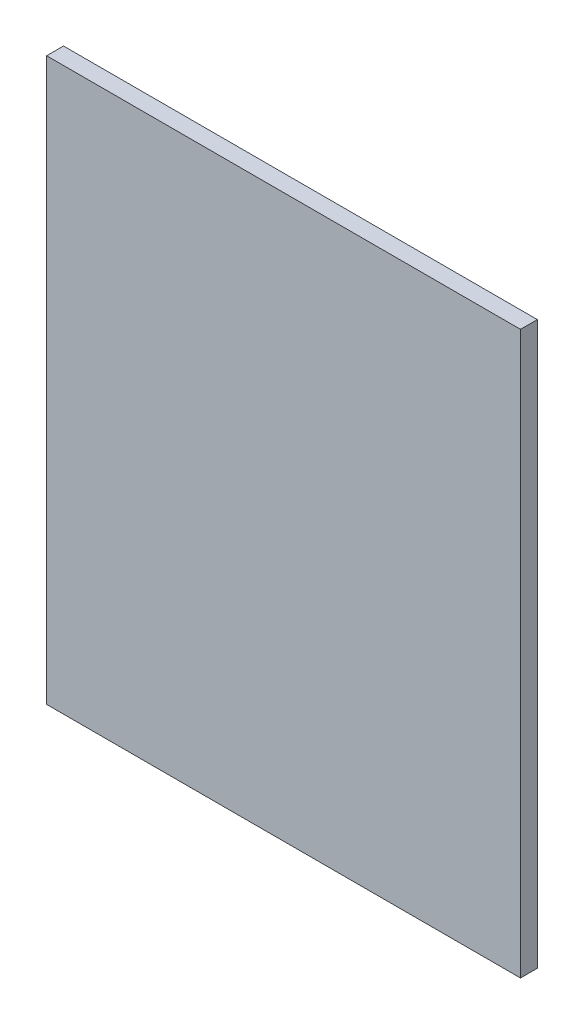
ISO-10303-21;
HEADER;
FILE_DESCRIPTION(('STEP AP214'),'2;1');
FILE_NAME('part.step','',(''),(''),'','','');
FILE_SCHEMA(('AUTOMOTIVE_DESIGN { 1 0 10303 214 1 1 1 1 }'));
ENDSEC;
DATA;
#1=APPLICATION_CONTEXT('core data for automotive mechanical design processes');
#2=APPLICATION_PROTOCOL_DEFINITION('international standard','automotive_design',2000,#1);
#3=PRODUCT_CONTEXT('',#1,'mechanical');
#4=PRODUCT('Part','Part','',(#3));
#5=PRODUCT_RELATED_PRODUCT_CATEGORY('part','',(#4));
#6=PRODUCT_DEFINITION_FORMATION('','',#4);
#7=PRODUCT_DEFINITION_CONTEXT('part definition',#1,'design');
#8=PRODUCT_DEFINITION('design','',#6,#7);
#9=PRODUCT_DEFINITION_SHAPE('','',#8);
#10=(LENGTH_UNIT() NAMED_UNIT(*) SI_UNIT(.MILLI.,.METRE.));
#11=(NAMED_UNIT(*) PLANE_ANGLE_UNIT() SI_UNIT($,.RADIAN.));
#12=(NAMED_UNIT(*) SI_UNIT($,.STERADIAN.) SOLID_ANGLE_UNIT());
#13=UNCERTAINTY_MEASURE_WITH_UNIT(LENGTH_MEASURE(1.E-05),#10,'distance_accuracy_value','');
#14=(GEOMETRIC_REPRESENTATION_CONTEXT(3) GLOBAL_UNCERTAINTY_ASSIGNED_CONTEXT((#13)) GLOBAL_UNIT_ASSIGNED_CONTEXT((#10,
#11,#12)) REPRESENTATION_CONTEXT('',''));
#15=CARTESIAN_POINT('',(0.,0.,0.));
#16=DIRECTION('',(0.,0.,1.));
#17=DIRECTION('',(1.,0.,0.));
#18=AXIS2_PLACEMENT_3D('',#15,#16,#17);
#19=CARTESIAN_POINT('',(0.,0.,2.));
#20=DIRECTION('',(1.,0.,0.));
#21=DIRECTION('',(0.,0.,-1.));
#22=AXIS2_PLACEMENT_3D('',#19,#20,#21);
#23=PLANE('',#22);
#24=DIRECTION('',(0.,-1.,0.));
#25=VECTOR('',#24,1.);
#26=CARTESIAN_POINT('',(0.,0.,0.));
#27=LINE('',#26,#25);
#28=CARTESIAN_POINT('',(0.,66.5805640276045,0.));
#29=VERTEX_POINT('',#28);
#30=CARTESIAN_POINT('',(0.,0.,0.));
#31=VERTEX_POINT('',#30);
#32=EDGE_CURVE('E96',#29,#31,#27,.T.);
#33=ORIENTED_EDGE('',*,*,#32,.T.);
#34=DIRECTION('',(0.,0.,-1.));
#35=VECTOR('',#34,1.);
#36=CARTESIAN_POINT('',(0.,0.,2.));
#37=LINE('',#36,#35);
#38=CARTESIAN_POINT('',(0.,0.,2.));
#39=VERTEX_POINT('',#38);
#40=EDGE_CURVE('E11',#39,#31,#37,.T.);
#41=ORIENTED_EDGE('',*,*,#40,.F.);
#42=DIRECTION('',(0.,-1.,0.));
#43=VECTOR('',#42,1.);
#44=CARTESIAN_POINT('',(0.,0.,2.));
#45=LINE('',#44,#43);
#46=CARTESIAN_POINT('',(0.,66.5805640276045,2.));
#47=VERTEX_POINT('',#46);
#48=EDGE_CURVE('E84',#47,#39,#45,.T.);
#49=ORIENTED_EDGE('',*,*,#48,.F.);
#50=DIRECTION('',(0.,0.,-1.));
#51=VECTOR('',#50,1.);
#52=CARTESIAN_POINT('',(0.,66.5805640276045,2.));
#53=LINE('',#52,#51);
#54=EDGE_CURVE('E92',#47,#29,#53,.T.);
#55=ORIENTED_EDGE('',*,*,#54,.T.);
#56=EDGE_LOOP('',(#33,#41,#49,#55));
#57=FACE_BOUND('',#56,.T.);
#58=ADVANCED_FACE('F33',(#57),#23,.F.);
#59=CARTESIAN_POINT('',(0.,0.,2.));
#60=DIRECTION('',(0.,1.,0.));
#61=DIRECTION('',(0.,0.,1.));
#62=AXIS2_PLACEMENT_3D('',#59,#60,#61);
#63=PLANE('',#62);
#64=DIRECTION('',(1.,0.,0.));
#65=VECTOR('',#64,1.);
#66=CARTESIAN_POINT('',(0.,0.,0.));
#67=LINE('',#66,#65);
#68=CARTESIAN_POINT('',(56.1625525865853,0.,0.));
#69=VERTEX_POINT('',#68);
#70=EDGE_CURVE('E88',#31,#69,#67,.T.);
#71=ORIENTED_EDGE('',*,*,#70,.T.);
#72=DIRECTION('',(0.,0.,-1.));
#73=VECTOR('',#72,1.);
#74=CARTESIAN_POINT('',(56.1625525865853,0.,2.));
#75=LINE('',#74,#73);
#76=CARTESIAN_POINT('',(56.1625525865853,0.,2.));
#77=VERTEX_POINT('',#76);
#78=EDGE_CURVE('E41',#77,#69,#75,.T.);
#79=ORIENTED_EDGE('',*,*,#78,.F.);
#80=DIRECTION('',(1.,0.,0.));
#81=VECTOR('',#80,1.);
#82=CARTESIAN_POINT('',(0.,0.,2.));
#83=LINE('',#82,#81);
#84=EDGE_CURVE('E79',#39,#77,#83,.T.);
#85=ORIENTED_EDGE('',*,*,#84,.F.);
#86=ORIENTED_EDGE('',*,*,#40,.T.);
#87=EDGE_LOOP('',(#71,#79,#85,#86));
#88=FACE_BOUND('',#87,.T.);
#89=ADVANCED_FACE('F87',(#88),#63,.F.);
#90=CARTESIAN_POINT('',(56.1625525865853,0.,2.));
#91=DIRECTION('',(-1.,0.,0.));
#92=DIRECTION('',(0.,0.,1.));
#93=AXIS2_PLACEMENT_3D('',#90,#91,#92);
#94=PLANE('',#93);
#95=DIRECTION('',(0.,1.,0.));
#96=VECTOR('',#95,1.);
#97=CARTESIAN_POINT('',(56.1625525865853,0.,0.));
#98=LINE('',#97,#96);
#99=CARTESIAN_POINT('',(56.1625525865853,66.5805640276045,0.));
#100=VERTEX_POINT('',#99);
#101=EDGE_CURVE('E66',#69,#100,#98,.T.);
#102=ORIENTED_EDGE('',*,*,#101,.T.);
#103=DIRECTION('',(0.,0.,-1.));
#104=VECTOR('',#103,1.);
#105=CARTESIAN_POINT('',(56.1625525865853,66.5805640276045,2.));
#106=LINE('',#105,#104);
#107=CARTESIAN_POINT('',(56.1625525865853,66.5805640276045,2.));
#108=VERTEX_POINT('',#107);
#109=EDGE_CURVE('E89',#108,#100,#106,.T.);
#110=ORIENTED_EDGE('',*,*,#109,.F.);
#111=DIRECTION('',(0.,1.,0.));
#112=VECTOR('',#111,1.);
#113=CARTESIAN_POINT('',(56.1625525865853,0.,2.));
#114=LINE('',#113,#112);
#115=EDGE_CURVE('E82',#77,#108,#114,.T.);
#116=ORIENTED_EDGE('',*,*,#115,.F.);
#117=ORIENTED_EDGE('',*,*,#78,.T.);
#118=EDGE_LOOP('',(#102,#110,#116,#117));
#119=FACE_BOUND('',#118,.T.);
#120=ADVANCED_FACE('F90',(#119),#94,.F.);
#121=CARTESIAN_POINT('',(0.,66.5805640276045,2.));
#122=DIRECTION('',(0.,-1.,0.));
#123=DIRECTION('',(0.,0.,-1.));
#124=AXIS2_PLACEMENT_3D('',#121,#122,#123);
#125=PLANE('',#124);
#126=DIRECTION('',(-1.,0.,0.));
#127=VECTOR('',#126,1.);
#128=CARTESIAN_POINT('',(0.,66.5805640276045,0.));
#129=LINE('',#128,#127);
#130=EDGE_CURVE('E72',#100,#29,#129,.T.);
#131=ORIENTED_EDGE('',*,*,#130,.T.);
#132=ORIENTED_EDGE('',*,*,#54,.F.);
#133=DIRECTION('',(-1.,0.,0.));
#134=VECTOR('',#133,1.);
#135=CARTESIAN_POINT('',(0.,66.5805640276045,2.));
#136=LINE('',#135,#134);
#137=EDGE_CURVE('E49',#108,#47,#136,.T.);
#138=ORIENTED_EDGE('',*,*,#137,.F.);
#139=ORIENTED_EDGE('',*,*,#109,.T.);
#140=EDGE_LOOP('',(#131,#132,#138,#139));
#141=FACE_BOUND('',#140,.T.);
#142=ADVANCED_FACE('F103',(#141),#125,.F.);
#143=CARTESIAN_POINT('',(0.,0.,2.));
#144=DIRECTION('',(0.,0.,-1.));
#145=DIRECTION('',(-1.,0.,0.));
#146=AXIS2_PLACEMENT_3D('',#143,#144,#145);
#147=PLANE('',#146);
#148=ORIENTED_EDGE('',*,*,#48,.T.);
#149=ORIENTED_EDGE('',*,*,#84,.T.);
#150=ORIENTED_EDGE('',*,*,#115,.T.);
#151=ORIENTED_EDGE('',*,*,#137,.T.);
#152=EDGE_LOOP('',(#148,#149,#150,#151));
#153=FACE_BOUND('',#152,.T.);
#154=ADVANCED_FACE('F80',(#153),#147,.F.);
#155=CARTESIAN_POINT('',(0.,0.,0.));
#156=DIRECTION('',(0.,0.,-1.));
#157=DIRECTION('',(-1.,0.,0.));
#158=AXIS2_PLACEMENT_3D('',#155,#156,#157);
#159=PLANE('',#158);
#160=ORIENTED_EDGE('',*,*,#32,.F.);
#161=ORIENTED_EDGE('',*,*,#130,.F.);
#162=ORIENTED_EDGE('',*,*,#101,.F.);
#163=ORIENTED_EDGE('',*,*,#70,.F.);
#164=EDGE_LOOP('',(#160,#161,#162,#163));
#165=FACE_BOUND('',#164,.T.);
#166=ADVANCED_FACE('F106',(#165),#159,.T.);
#167=CLOSED_SHELL('',(#58,#89,#120,#142,#154,#166));
#168=MANIFOLD_SOLID_BREP('B2',#167);
#169=ADVANCED_BREP_SHAPE_REPRESENTATION('',(#18,#168),#14);
#170=SHAPE_DEFINITION_REPRESENTATION(#9,#169);
ENDSEC;
END-ISO-10303-21;
